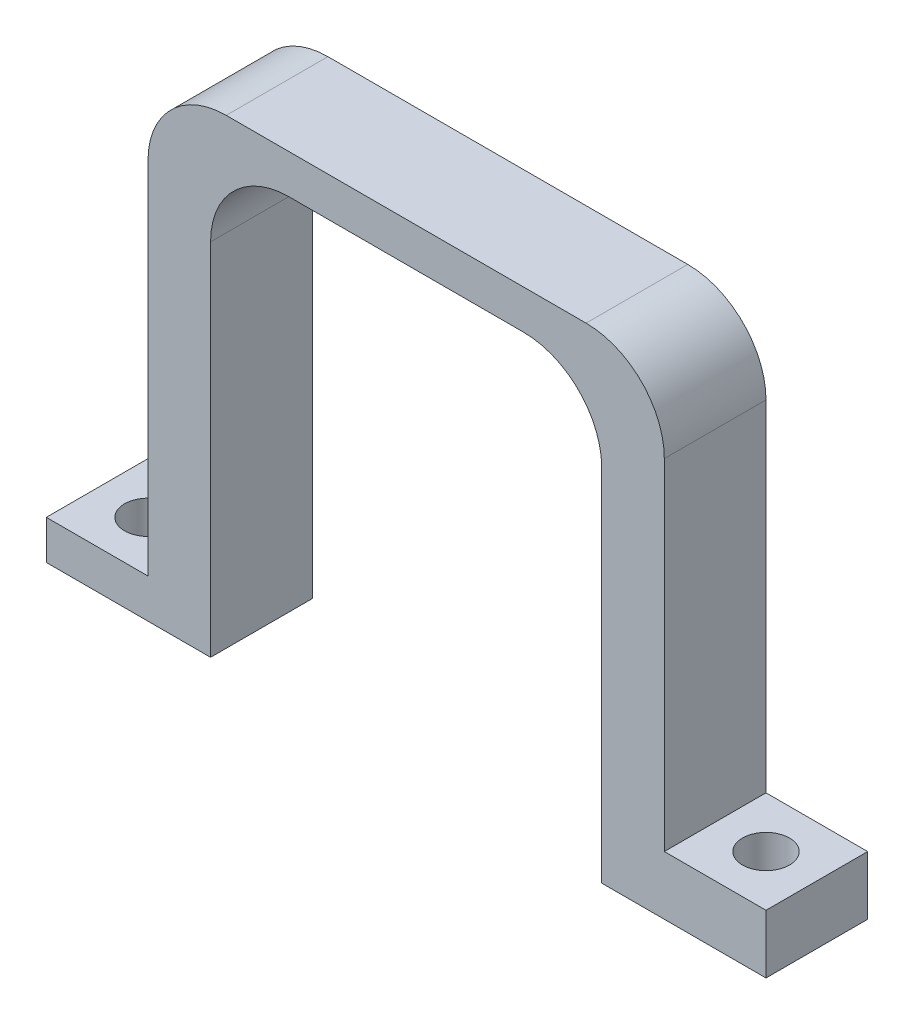
ISO-10303-21;
HEADER;
FILE_DESCRIPTION(('STEP AP214'),'2;1');
FILE_NAME('part.step','',(''),(''),'','','');
FILE_SCHEMA(('AUTOMOTIVE_DESIGN { 1 0 10303 214 1 1 1 1 }'));
ENDSEC;
DATA;
#1=APPLICATION_CONTEXT('core data for automotive mechanical design processes');
#2=APPLICATION_PROTOCOL_DEFINITION('international standard','automotive_design',2000,#1);
#3=PRODUCT_CONTEXT('',#1,'mechanical');
#4=PRODUCT('Part','Part','',(#3));
#5=PRODUCT_RELATED_PRODUCT_CATEGORY('part','',(#4));
#6=PRODUCT_DEFINITION_FORMATION('','',#4);
#7=PRODUCT_DEFINITION_CONTEXT('part definition',#1,'design');
#8=PRODUCT_DEFINITION('design','',#6,#7);
#9=PRODUCT_DEFINITION_SHAPE('','',#8);
#10=(LENGTH_UNIT() NAMED_UNIT(*) SI_UNIT(.MILLI.,.METRE.));
#11=(NAMED_UNIT(*) PLANE_ANGLE_UNIT() SI_UNIT($,.RADIAN.));
#12=(NAMED_UNIT(*) SI_UNIT($,.STERADIAN.) SOLID_ANGLE_UNIT());
#13=UNCERTAINTY_MEASURE_WITH_UNIT(LENGTH_MEASURE(1.E-05),#10,'distance_accuracy_value','');
#14=(GEOMETRIC_REPRESENTATION_CONTEXT(3) GLOBAL_UNCERTAINTY_ASSIGNED_CONTEXT((#13)) GLOBAL_UNIT_ASSIGNED_CONTEXT((#10,
#11,#12)) REPRESENTATION_CONTEXT('',''));
#15=CARTESIAN_POINT('',(0.,0.,0.));
#16=DIRECTION('',(0.,0.,1.));
#17=DIRECTION('',(1.,0.,0.));
#18=AXIS2_PLACEMENT_3D('',#15,#16,#17);
#19=CARTESIAN_POINT('',(6.6,6.1,2.6));
#20=DIRECTION('',(1.,0.,0.));
#21=DIRECTION('',(0.,0.,-1.));
#22=AXIS2_PLACEMENT_3D('',#19,#20,#21);
#23=PLANE('',#22);
#24=DIRECTION('',(0.,-1.,0.));
#25=VECTOR('',#24,1.);
#26=CARTESIAN_POINT('',(6.6,6.1,2.6));
#27=LINE('',#26,#25);
#28=CARTESIAN_POINT('',(6.6,4.1,2.6));
#29=VERTEX_POINT('',#28);
#30=CARTESIAN_POINT('',(6.6,-4.6,2.6));
#31=VERTEX_POINT('',#30);
#32=EDGE_CURVE('E77',#29,#31,#27,.T.);
#33=ORIENTED_EDGE('',*,*,#32,.T.);
#34=DIRECTION('',(0.,0.,1.));
#35=VECTOR('',#34,1.);
#36=CARTESIAN_POINT('',(6.6,-4.6,0.));
#37=LINE('',#36,#35);
#38=CARTESIAN_POINT('',(6.6,-4.6,0.));
#39=VERTEX_POINT('',#38);
#40=EDGE_CURVE('E82',#39,#31,#37,.T.);
#41=ORIENTED_EDGE('',*,*,#40,.F.);
#42=DIRECTION('',(0.,-1.,0.));
#43=VECTOR('',#42,1.);
#44=CARTESIAN_POINT('',(6.6,6.1,0.));
#45=LINE('',#44,#43);
#46=CARTESIAN_POINT('',(6.6,4.1,0.));
#47=VERTEX_POINT('',#46);
#48=EDGE_CURVE('E273',#47,#39,#45,.T.);
#49=ORIENTED_EDGE('',*,*,#48,.F.);
#50=DIRECTION('',(0.,0.,-1.));
#51=VECTOR('',#50,1.);
#52=CARTESIAN_POINT('',(6.6,4.1,2.6));
#53=LINE('',#52,#51);
#54=EDGE_CURVE('E290',#47,#29,#53,.F.);
#55=ORIENTED_EDGE('',*,*,#54,.T.);
#56=EDGE_LOOP('',(#33,#41,#49,#55));
#57=FACE_BOUND('',#56,.T.);
#58=ADVANCED_FACE('F61',(#57),#23,.T.);
#59=CARTESIAN_POINT('',(-6.6,6.1,2.6));
#60=DIRECTION('',(1.,0.,0.));
#61=DIRECTION('',(0.,0.,-1.));
#62=AXIS2_PLACEMENT_3D('',#59,#60,#61);
#63=PLANE('',#62);
#64=DIRECTION('',(0.,-1.,0.));
#65=VECTOR('',#64,1.);
#66=CARTESIAN_POINT('',(-6.6,6.1,0.));
#67=LINE('',#66,#65);
#68=CARTESIAN_POINT('',(-6.6,4.1,0.));
#69=VERTEX_POINT('',#68);
#70=CARTESIAN_POINT('',(-6.6,-5.09999999999996,0.));
#71=VERTEX_POINT('',#70);
#72=EDGE_CURVE('E193',#69,#71,#67,.T.);
#73=ORIENTED_EDGE('',*,*,#72,.T.);
#74=DIRECTION('',(0.,0.,-1.));
#75=VECTOR('',#74,1.);
#76=CARTESIAN_POINT('',(-6.6,-5.09999999999996,2.6));
#77=LINE('',#76,#75);
#78=CARTESIAN_POINT('',(-6.6,-5.09999999999996,2.6));
#79=VERTEX_POINT('',#78);
#80=EDGE_CURVE('E190',#79,#71,#77,.T.);
#81=ORIENTED_EDGE('',*,*,#80,.F.);
#82=DIRECTION('',(0.,-1.,0.));
#83=VECTOR('',#82,1.);
#84=CARTESIAN_POINT('',(-6.6,6.1,2.6));
#85=LINE('',#84,#83);
#86=CARTESIAN_POINT('',(-6.6,4.1,2.6));
#87=VERTEX_POINT('',#86);
#88=EDGE_CURVE('E174',#87,#79,#85,.T.);
#89=ORIENTED_EDGE('',*,*,#88,.F.);
#90=DIRECTION('',(0.,0.,-1.));
#91=VECTOR('',#90,1.);
#92=CARTESIAN_POINT('',(-6.6,4.1,0.));
#93=LINE('',#92,#91);
#94=EDGE_CURVE('E267',#87,#69,#93,.T.);
#95=ORIENTED_EDGE('',*,*,#94,.T.);
#96=EDGE_LOOP('',(#73,#81,#89,#95));
#97=FACE_BOUND('',#96,.T.);
#98=ADVANCED_FACE('F191',(#97),#63,.F.);
#99=CARTESIAN_POINT('',(-6.6,-6.1,2.6));
#100=DIRECTION('',(0.,1.,0.));
#101=DIRECTION('',(0.,0.,1.));
#102=AXIS2_PLACEMENT_3D('',#99,#100,#101);
#103=PLANE('',#102);
#104=DIRECTION('',(0.,0.,-1.));
#105=VECTOR('',#104,1.);
#106=CARTESIAN_POINT('',(-5.,-6.1,2.6));
#107=LINE('',#106,#105);
#108=CARTESIAN_POINT('',(-5.,-6.1,2.6));
#109=VERTEX_POINT('',#108);
#110=CARTESIAN_POINT('',(-5.,-6.1,0.));
#111=VERTEX_POINT('',#110);
#112=EDGE_CURVE('E255',#109,#111,#107,.T.);
#113=ORIENTED_EDGE('',*,*,#112,.F.);
#114=DIRECTION('',(1.,0.,0.));
#115=VECTOR('',#114,1.);
#116=CARTESIAN_POINT('',(-6.6,-6.1,2.6));
#117=LINE('',#116,#115);
#118=CARTESIAN_POINT('',(-9.19999999999999,-6.1,2.6));
#119=VERTEX_POINT('',#118);
#120=EDGE_CURVE('E260',#119,#109,#117,.T.);
#121=ORIENTED_EDGE('',*,*,#120,.F.);
#122=DIRECTION('',(0.,0.,1.));
#123=VECTOR('',#122,1.);
#124=CARTESIAN_POINT('',(-9.19999999999999,-6.1,0.));
#125=LINE('',#124,#123);
#126=CARTESIAN_POINT('',(-9.19999999999999,-6.1,0.));
#127=VERTEX_POINT('',#126);
#128=EDGE_CURVE('E233',#127,#119,#125,.T.);
#129=ORIENTED_EDGE('',*,*,#128,.F.);
#130=DIRECTION('',(1.,0.,0.));
#131=VECTOR('',#130,1.);
#132=CARTESIAN_POINT('',(-6.6,-6.1,0.));
#133=LINE('',#132,#131);
#134=EDGE_CURVE('E270',#127,#111,#133,.T.);
#135=ORIENTED_EDGE('',*,*,#134,.T.);
#136=EDGE_LOOP('',(#113,#121,#129,#135));
#137=FACE_BOUND('',#136,.T.);
#138=CARTESIAN_POINT('',(-7.89999999999999,-6.1,1.3));
#139=DIRECTION('',(0.,-1.,0.));
#140=DIRECTION('',(0.,0.,-1.));
#141=AXIS2_PLACEMENT_3D('',#138,#139,#140);
#142=CIRCLE('',#141,0.6);
#143=CARTESIAN_POINT('',(-7.89999999999999,-6.1,0.7));
#144=VERTEX_POINT('',#143);
#145=EDGE_CURVE('E228',#144,#144,#142,.T.);
#146=ORIENTED_EDGE('',*,*,#145,.F.);
#147=EDGE_LOOP('',(#146));
#148=FACE_BOUND('',#147,.T.);
#149=ADVANCED_FACE('F355',(#137,#148),#103,.F.);
#150=CARTESIAN_POINT('',(0.,0.,2.6));
#151=DIRECTION('',(0.,0.,1.));
#152=DIRECTION('',(1.,0.,0.));
#153=AXIS2_PLACEMENT_3D('',#150,#151,#152);
#154=PLANE('',#153);
#155=ORIENTED_EDGE('',*,*,#88,.T.);
#156=DIRECTION('',(-1.,0.,0.));
#157=VECTOR('',#156,1.);
#158=CARTESIAN_POINT('',(-6.6,-5.09999999999996,2.6));
#159=LINE('',#158,#157);
#160=CARTESIAN_POINT('',(-9.19999999999999,-5.09999999999996,2.6));
#161=VERTEX_POINT('',#160);
#162=EDGE_CURVE('E178',#79,#161,#159,.T.);
#163=ORIENTED_EDGE('',*,*,#162,.T.);
#164=DIRECTION('',(0.,-1.,0.));
#165=VECTOR('',#164,1.);
#166=CARTESIAN_POINT('',(-9.19999999999999,-4.6,2.6));
#167=LINE('',#166,#165);
#168=EDGE_CURVE('E237',#161,#119,#167,.T.);
#169=ORIENTED_EDGE('',*,*,#168,.T.);
#170=ORIENTED_EDGE('',*,*,#120,.T.);
#171=DIRECTION('',(0.,-1.,0.));
#172=VECTOR('',#171,1.);
#173=CARTESIAN_POINT('',(-5.,5.1,2.6));
#174=LINE('',#173,#172);
#175=CARTESIAN_POINT('',(-5.,3.1,2.6));
#176=VERTEX_POINT('',#175);
#177=EDGE_CURVE('E247',#176,#109,#174,.T.);
#178=ORIENTED_EDGE('',*,*,#177,.F.);
#179=CARTESIAN_POINT('',(-3.,3.1,2.6));
#180=DIRECTION('',(0.,0.,1.));
#181=DIRECTION('',(1.,0.,0.));
#182=AXIS2_PLACEMENT_3D('',#179,#180,#181);
#183=CIRCLE('',#182,2.);
#184=CARTESIAN_POINT('',(-3.,5.1,2.6));
#185=VERTEX_POINT('',#184);
#186=EDGE_CURVE('E304',#176,#185,#183,.F.);
#187=ORIENTED_EDGE('',*,*,#186,.T.);
#188=DIRECTION('',(1.,0.,0.));
#189=VECTOR('',#188,1.);
#190=CARTESIAN_POINT('',(-5.,5.1,2.6));
#191=LINE('',#190,#189);
#192=CARTESIAN_POINT('',(3.,5.1,2.6));
#193=VERTEX_POINT('',#192);
#194=EDGE_CURVE('E241',#185,#193,#191,.T.);
#195=ORIENTED_EDGE('',*,*,#194,.T.);
#196=CARTESIAN_POINT('',(3.,3.1,2.6));
#197=DIRECTION('',(0.,0.,1.));
#198=DIRECTION('',(1.,0.,0.));
#199=AXIS2_PLACEMENT_3D('',#196,#197,#198);
#200=CIRCLE('',#199,2.);
#201=CARTESIAN_POINT('',(5.,3.1,2.6));
#202=VERTEX_POINT('',#201);
#203=EDGE_CURVE('E12',#193,#202,#200,.F.);
#204=ORIENTED_EDGE('',*,*,#203,.T.);
#205=DIRECTION('',(0.,-1.,0.));
#206=VECTOR('',#205,1.);
#207=CARTESIAN_POINT('',(5.,5.1,2.6));
#208=LINE('',#207,#206);
#209=CARTESIAN_POINT('',(5.,-6.1,2.6));
#210=VERTEX_POINT('',#209);
#211=EDGE_CURVE('E244',#202,#210,#208,.T.);
#212=ORIENTED_EDGE('',*,*,#211,.T.);
#213=CARTESIAN_POINT('',(9.2,-6.1,2.6));
#214=VERTEX_POINT('',#213);
#215=EDGE_CURVE('E186',#210,#214,#117,.T.);
#216=ORIENTED_EDGE('',*,*,#215,.T.);
#217=DIRECTION('',(0.,-1.,0.));
#218=VECTOR('',#217,1.);
#219=CARTESIAN_POINT('',(9.2,-4.6,2.6));
#220=LINE('',#219,#218);
#221=CARTESIAN_POINT('',(9.2,-4.6,2.6));
#222=VERTEX_POINT('',#221);
#223=EDGE_CURVE('E225',#222,#214,#220,.T.);
#224=ORIENTED_EDGE('',*,*,#223,.F.);
#225=DIRECTION('',(1.,0.,0.));
#226=VECTOR('',#225,1.);
#227=CARTESIAN_POINT('',(0.,-4.6,2.6));
#228=LINE('',#227,#226);
#229=EDGE_CURVE('E216',#31,#222,#228,.T.);
#230=ORIENTED_EDGE('',*,*,#229,.F.);
#231=ORIENTED_EDGE('',*,*,#32,.F.);
#232=CARTESIAN_POINT('',(4.6,4.1,2.6));
#233=DIRECTION('',(0.,0.,1.));
#234=DIRECTION('',(1.,0.,0.));
#235=AXIS2_PLACEMENT_3D('',#232,#233,#234);
#236=CIRCLE('',#235,2.);
#237=CARTESIAN_POINT('',(4.6,6.1,2.6));
#238=VERTEX_POINT('',#237);
#239=EDGE_CURVE('E287',#29,#238,#236,.T.);
#240=ORIENTED_EDGE('',*,*,#239,.T.);
#241=DIRECTION('',(1.,0.,0.));
#242=VECTOR('',#241,1.);
#243=CARTESIAN_POINT('',(-6.6,6.1,2.6));
#244=LINE('',#243,#242);
#245=CARTESIAN_POINT('',(-4.6,6.1,2.6));
#246=VERTEX_POINT('',#245);
#247=EDGE_CURVE('E264',#246,#238,#244,.T.);
#248=ORIENTED_EDGE('',*,*,#247,.F.);
#249=CARTESIAN_POINT('',(-4.6,4.1,2.6));
#250=DIRECTION('',(0.,0.,1.));
#251=DIRECTION('',(1.,0.,0.));
#252=AXIS2_PLACEMENT_3D('',#249,#250,#251);
#253=CIRCLE('',#252,2.);
#254=EDGE_CURVE('E182',#246,#87,#253,.T.);
#255=ORIENTED_EDGE('',*,*,#254,.T.);
#256=EDGE_LOOP('',(#155,#163,#169,#170,#178,#187,#195,#204,#212,#216,#224,#230,#231,#240,#248,#255));
#257=FACE_BOUND('',#256,.T.);
#258=ADVANCED_FACE('F176',(#257),#154,.T.);
#259=CARTESIAN_POINT('',(0.,0.,0.));
#260=DIRECTION('',(0.,0.,1.));
#261=DIRECTION('',(1.,0.,0.));
#262=AXIS2_PLACEMENT_3D('',#259,#260,#261);
#263=PLANE('',#262);
#264=DIRECTION('',(-1.,0.,0.));
#265=VECTOR('',#264,1.);
#266=CARTESIAN_POINT('',(-6.6,-5.09999999999996,0.));
#267=LINE('',#266,#265);
#268=CARTESIAN_POINT('',(-9.19999999999999,-5.09999999999996,0.));
#269=VERTEX_POINT('',#268);
#270=EDGE_CURVE('E201',#71,#269,#267,.T.);
#271=ORIENTED_EDGE('',*,*,#270,.F.);
#272=ORIENTED_EDGE('',*,*,#72,.F.);
#273=CARTESIAN_POINT('',(-4.6,4.1,0.));
#274=DIRECTION('',(0.,0.,1.));
#275=DIRECTION('',(1.,0.,0.));
#276=AXIS2_PLACEMENT_3D('',#273,#274,#275);
#277=CIRCLE('',#276,2.);
#278=CARTESIAN_POINT('',(-4.6,6.1,0.));
#279=VERTEX_POINT('',#278);
#280=EDGE_CURVE('E280',#69,#279,#277,.F.);
#281=ORIENTED_EDGE('',*,*,#280,.T.);
#282=DIRECTION('',(1.,0.,0.));
#283=VECTOR('',#282,1.);
#284=CARTESIAN_POINT('',(-6.6,6.1,0.));
#285=LINE('',#284,#283);
#286=CARTESIAN_POINT('',(4.6,6.1,0.));
#287=VERTEX_POINT('',#286);
#288=EDGE_CURVE('E187',#279,#287,#285,.T.);
#289=ORIENTED_EDGE('',*,*,#288,.T.);
#290=CARTESIAN_POINT('',(4.6,4.1,0.));
#291=DIRECTION('',(0.,0.,1.));
#292=DIRECTION('',(1.,0.,0.));
#293=AXIS2_PLACEMENT_3D('',#290,#291,#292);
#294=CIRCLE('',#293,2.);
#295=EDGE_CURVE('E278',#287,#47,#294,.F.);
#296=ORIENTED_EDGE('',*,*,#295,.T.);
#297=ORIENTED_EDGE('',*,*,#48,.T.);
#298=DIRECTION('',(1.,0.,0.));
#299=VECTOR('',#298,1.);
#300=CARTESIAN_POINT('',(0.,-4.6,0.));
#301=LINE('',#300,#299);
#302=CARTESIAN_POINT('',(9.2,-4.6,0.));
#303=VERTEX_POINT('',#302);
#304=EDGE_CURVE('E209',#39,#303,#301,.T.);
#305=ORIENTED_EDGE('',*,*,#304,.T.);
#306=DIRECTION('',(0.,-1.,0.));
#307=VECTOR('',#306,1.);
#308=CARTESIAN_POINT('',(9.2,-4.6,0.));
#309=LINE('',#308,#307);
#310=CARTESIAN_POINT('',(9.2,-6.1,0.));
#311=VERTEX_POINT('',#310);
#312=EDGE_CURVE('E219',#303,#311,#309,.T.);
#313=ORIENTED_EDGE('',*,*,#312,.T.);
#314=CARTESIAN_POINT('',(5.,-6.1,0.));
#315=VERTEX_POINT('',#314);
#316=EDGE_CURVE('E269',#315,#311,#133,.T.);
#317=ORIENTED_EDGE('',*,*,#316,.F.);
#318=DIRECTION('',(0.,-1.,0.));
#319=VECTOR('',#318,1.);
#320=CARTESIAN_POINT('',(5.,5.1,0.));
#321=LINE('',#320,#319);
#322=CARTESIAN_POINT('',(5.,3.1,0.));
#323=VERTEX_POINT('',#322);
#324=EDGE_CURVE('E252',#323,#315,#321,.T.);
#325=ORIENTED_EDGE('',*,*,#324,.F.);
#326=CARTESIAN_POINT('',(3.,3.1,0.));
#327=DIRECTION('',(0.,0.,1.));
#328=DIRECTION('',(1.,0.,0.));
#329=AXIS2_PLACEMENT_3D('',#326,#327,#328);
#330=CIRCLE('',#329,2.);
#331=CARTESIAN_POINT('',(3.,5.1,0.));
#332=VERTEX_POINT('',#331);
#333=EDGE_CURVE('E70',#323,#332,#330,.T.);
#334=ORIENTED_EDGE('',*,*,#333,.T.);
#335=DIRECTION('',(1.,0.,0.));
#336=VECTOR('',#335,1.);
#337=CARTESIAN_POINT('',(-5.,5.1,0.));
#338=LINE('',#337,#336);
#339=CARTESIAN_POINT('',(-3.,5.1,0.));
#340=VERTEX_POINT('',#339);
#341=EDGE_CURVE('E239',#340,#332,#338,.T.);
#342=ORIENTED_EDGE('',*,*,#341,.F.);
#343=CARTESIAN_POINT('',(-3.,3.1,0.));
#344=DIRECTION('',(0.,0.,1.));
#345=DIRECTION('',(1.,0.,0.));
#346=AXIS2_PLACEMENT_3D('',#343,#344,#345);
#347=CIRCLE('',#346,2.);
#348=CARTESIAN_POINT('',(-5.,3.1,0.));
#349=VERTEX_POINT('',#348);
#350=EDGE_CURVE('E302',#340,#349,#347,.T.);
#351=ORIENTED_EDGE('',*,*,#350,.T.);
#352=DIRECTION('',(0.,-1.,0.));
#353=VECTOR('',#352,1.);
#354=CARTESIAN_POINT('',(-5.,5.1,0.));
#355=LINE('',#354,#353);
#356=EDGE_CURVE('E245',#349,#111,#355,.T.);
#357=ORIENTED_EDGE('',*,*,#356,.T.);
#358=ORIENTED_EDGE('',*,*,#134,.F.);
#359=DIRECTION('',(0.,-1.,0.));
#360=VECTOR('',#359,1.);
#361=CARTESIAN_POINT('',(-9.19999999999999,-4.6,0.));
#362=LINE('',#361,#360);
#363=EDGE_CURVE('E236',#269,#127,#362,.T.);
#364=ORIENTED_EDGE('',*,*,#363,.F.);
#365=EDGE_LOOP('',(#271,#272,#281,#289,#296,#297,#305,#313,#317,#325,#334,#342,#351,#357,#358,#364));
#366=FACE_BOUND('',#365,.T.);
#367=ADVANCED_FACE('F309',(#366),#263,.F.);
#368=ORIENTED_EDGE('',*,*,#215,.F.);
#369=DIRECTION('',(0.,0.,-1.));
#370=VECTOR('',#369,1.);
#371=CARTESIAN_POINT('',(5.,-6.1,2.6));
#372=LINE('',#371,#370);
#373=EDGE_CURVE('E249',#210,#315,#372,.T.);
#374=ORIENTED_EDGE('',*,*,#373,.T.);
#375=ORIENTED_EDGE('',*,*,#316,.T.);
#376=DIRECTION('',(0.,0.,1.));
#377=VECTOR('',#376,1.);
#378=CARTESIAN_POINT('',(9.2,-6.1,0.));
#379=LINE('',#378,#377);
#380=EDGE_CURVE('E210',#311,#214,#379,.T.);
#381=ORIENTED_EDGE('',*,*,#380,.T.);
#382=EDGE_LOOP('',(#368,#374,#375,#381));
#383=FACE_BOUND('',#382,.T.);
#384=CARTESIAN_POINT('',(7.9,-6.1,1.3));
#385=DIRECTION('',(0.,-1.,0.));
#386=DIRECTION('',(0.,0.,-1.));
#387=AXIS2_PLACEMENT_3D('',#384,#385,#386);
#388=CIRCLE('',#387,0.6);
#389=CARTESIAN_POINT('',(7.9,-6.1,0.7));
#390=VERTEX_POINT('',#389);
#391=EDGE_CURVE('E220',#390,#390,#388,.T.);
#392=ORIENTED_EDGE('',*,*,#391,.F.);
#393=EDGE_LOOP('',(#392));
#394=FACE_BOUND('',#393,.T.);
#395=ADVANCED_FACE('F325',(#383,#394),#103,.F.);
#396=CARTESIAN_POINT('',(-6.6,6.1,2.6));
#397=DIRECTION('',(0.,1.,0.));
#398=DIRECTION('',(0.,0.,1.));
#399=AXIS2_PLACEMENT_3D('',#396,#397,#398);
#400=PLANE('',#399);
#401=ORIENTED_EDGE('',*,*,#288,.F.);
#402=DIRECTION('',(0.,0.,-1.));
#403=VECTOR('',#402,1.);
#404=CARTESIAN_POINT('',(-4.6,6.1,2.6));
#405=LINE('',#404,#403);
#406=EDGE_CURVE('E285',#279,#246,#405,.F.);
#407=ORIENTED_EDGE('',*,*,#406,.T.);
#408=ORIENTED_EDGE('',*,*,#247,.T.);
#409=DIRECTION('',(0.,0.,-1.));
#410=VECTOR('',#409,1.);
#411=CARTESIAN_POINT('',(4.6,6.1,2.6));
#412=LINE('',#411,#410);
#413=EDGE_CURVE('E282',#238,#287,#412,.T.);
#414=ORIENTED_EDGE('',*,*,#413,.T.);
#415=EDGE_LOOP('',(#401,#407,#408,#414));
#416=FACE_BOUND('',#415,.T.);
#417=ADVANCED_FACE('F342',(#416),#400,.T.);
#418=CARTESIAN_POINT('',(-5.,5.1,2.6));
#419=DIRECTION('',(0.,1.,0.));
#420=DIRECTION('',(-1.,0.,0.));
#421=AXIS2_PLACEMENT_3D('',#418,#419,#420);
#422=PLANE('',#421);
#423=ORIENTED_EDGE('',*,*,#194,.F.);
#424=DIRECTION('',(0.,0.,-1.));
#425=VECTOR('',#424,1.);
#426=CARTESIAN_POINT('',(-3.,5.1,2.6));
#427=LINE('',#426,#425);
#428=EDGE_CURVE('E294',#185,#340,#427,.T.);
#429=ORIENTED_EDGE('',*,*,#428,.T.);
#430=ORIENTED_EDGE('',*,*,#341,.T.);
#431=DIRECTION('',(0.,0.,-1.));
#432=VECTOR('',#431,1.);
#433=CARTESIAN_POINT('',(3.,5.1,2.6));
#434=LINE('',#433,#432);
#435=EDGE_CURVE('E292',#332,#193,#434,.F.);
#436=ORIENTED_EDGE('',*,*,#435,.T.);
#437=EDGE_LOOP('',(#423,#429,#430,#436));
#438=FACE_BOUND('',#437,.T.);
#439=ADVANCED_FACE('F316',(#438),#422,.F.);
#440=CARTESIAN_POINT('',(-5.,5.1,2.6));
#441=DIRECTION('',(1.,0.,0.));
#442=DIRECTION('',(0.,1.,0.));
#443=AXIS2_PLACEMENT_3D('',#440,#441,#442);
#444=PLANE('',#443);
#445=ORIENTED_EDGE('',*,*,#356,.F.);
#446=DIRECTION('',(0.,0.,-1.));
#447=VECTOR('',#446,1.);
#448=CARTESIAN_POINT('',(-5.,3.1,2.6));
#449=LINE('',#448,#447);
#450=EDGE_CURVE('E297',#349,#176,#449,.F.);
#451=ORIENTED_EDGE('',*,*,#450,.T.);
#452=ORIENTED_EDGE('',*,*,#177,.T.);
#453=ORIENTED_EDGE('',*,*,#112,.T.);
#454=EDGE_LOOP('',(#445,#451,#452,#453));
#455=FACE_BOUND('',#454,.T.);
#456=ADVANCED_FACE('F359',(#455),#444,.T.);
#457=CARTESIAN_POINT('',(5.,5.1,2.6));
#458=DIRECTION('',(1.,0.,0.));
#459=DIRECTION('',(0.,1.,0.));
#460=AXIS2_PLACEMENT_3D('',#457,#458,#459);
#461=PLANE('',#460);
#462=ORIENTED_EDGE('',*,*,#211,.F.);
#463=DIRECTION('',(0.,0.,-1.));
#464=VECTOR('',#463,1.);
#465=CARTESIAN_POINT('',(5.,3.1,0.));
#466=LINE('',#465,#464);
#467=EDGE_CURVE('E299',#202,#323,#466,.T.);
#468=ORIENTED_EDGE('',*,*,#467,.T.);
#469=ORIENTED_EDGE('',*,*,#324,.T.);
#470=ORIENTED_EDGE('',*,*,#373,.F.);
#471=EDGE_LOOP('',(#462,#468,#469,#470));
#472=FACE_BOUND('',#471,.T.);
#473=ADVANCED_FACE('F322',(#472),#461,.F.);
#474=CARTESIAN_POINT('',(-4.6,4.1,2.6));
#475=DIRECTION('',(0.,0.,1.));
#476=DIRECTION('',(1.,0.,0.));
#477=AXIS2_PLACEMENT_3D('',#474,#475,#476);
#478=CYLINDRICAL_SURFACE('',#477,2.);
#479=ORIENTED_EDGE('',*,*,#254,.F.);
#480=ORIENTED_EDGE('',*,*,#406,.F.);
#481=ORIENTED_EDGE('',*,*,#280,.F.);
#482=ORIENTED_EDGE('',*,*,#94,.F.);
#483=EDGE_LOOP('',(#479,#480,#481,#482));
#484=FACE_BOUND('',#483,.T.);
#485=ADVANCED_FACE('F345',(#484),#478,.T.);
#486=CARTESIAN_POINT('',(4.6,4.1,2.6));
#487=DIRECTION('',(0.,0.,-1.));
#488=DIRECTION('',(-1.,0.,0.));
#489=AXIS2_PLACEMENT_3D('',#486,#487,#488);
#490=CYLINDRICAL_SURFACE('',#489,2.);
#491=ORIENTED_EDGE('',*,*,#239,.F.);
#492=ORIENTED_EDGE('',*,*,#54,.F.);
#493=ORIENTED_EDGE('',*,*,#295,.F.);
#494=ORIENTED_EDGE('',*,*,#413,.F.);
#495=EDGE_LOOP('',(#491,#492,#493,#494));
#496=FACE_BOUND('',#495,.T.);
#497=ADVANCED_FACE('F338',(#496),#490,.T.);
#498=CARTESIAN_POINT('',(-3.,3.1,2.6));
#499=DIRECTION('',(0.,0.,-1.));
#500=DIRECTION('',(-1.,0.,0.));
#501=AXIS2_PLACEMENT_3D('',#498,#499,#500);
#502=CYLINDRICAL_SURFACE('',#501,2.);
#503=ORIENTED_EDGE('',*,*,#186,.F.);
#504=ORIENTED_EDGE('',*,*,#450,.F.);
#505=ORIENTED_EDGE('',*,*,#350,.F.);
#506=ORIENTED_EDGE('',*,*,#428,.F.);
#507=EDGE_LOOP('',(#503,#504,#505,#506));
#508=FACE_BOUND('',#507,.T.);
#509=ADVANCED_FACE('F363',(#508),#502,.F.);
#510=CARTESIAN_POINT('',(3.,3.1,2.6));
#511=DIRECTION('',(0.,0.,1.));
#512=DIRECTION('',(1.,0.,0.));
#513=AXIS2_PLACEMENT_3D('',#510,#511,#512);
#514=CYLINDRICAL_SURFACE('',#513,2.);
#515=ORIENTED_EDGE('',*,*,#203,.F.);
#516=ORIENTED_EDGE('',*,*,#435,.F.);
#517=ORIENTED_EDGE('',*,*,#333,.F.);
#518=ORIENTED_EDGE('',*,*,#467,.F.);
#519=EDGE_LOOP('',(#515,#516,#517,#518));
#520=FACE_BOUND('',#519,.T.);
#521=ADVANCED_FACE('F63',(#520),#514,.F.);
#522=CARTESIAN_POINT('',(-9.19999999999999,-4.6,0.));
#523=DIRECTION('',(1.,0.,0.));
#524=DIRECTION('',(0.,0.,-1.));
#525=AXIS2_PLACEMENT_3D('',#522,#523,#524);
#526=PLANE('',#525);
#527=ORIENTED_EDGE('',*,*,#168,.F.);
#528=DIRECTION('',(0.,0.,-1.));
#529=VECTOR('',#528,1.);
#530=CARTESIAN_POINT('',(-9.19999999999999,-5.09999999999996,2.6));
#531=LINE('',#530,#529);
#532=EDGE_CURVE('E196',#161,#269,#531,.T.);
#533=ORIENTED_EDGE('',*,*,#532,.T.);
#534=ORIENTED_EDGE('',*,*,#363,.T.);
#535=ORIENTED_EDGE('',*,*,#128,.T.);
#536=EDGE_LOOP('',(#527,#533,#534,#535));
#537=FACE_BOUND('',#536,.T.);
#538=ADVANCED_FACE('F349',(#537),#526,.F.);
#539=CARTESIAN_POINT('',(-7.89999999999999,-4.6,1.3));
#540=DIRECTION('',(0.,-1.,0.));
#541=DIRECTION('',(0.,0.,-1.));
#542=AXIS2_PLACEMENT_3D('',#539,#540,#541);
#543=CYLINDRICAL_SURFACE('',#542,0.6);
#544=CARTESIAN_POINT('',(-7.89999999999999,-5.09999999999996,1.3));
#545=DIRECTION('',(0.,-1.,0.));
#546=DIRECTION('',(0.,0.,-1.));
#547=AXIS2_PLACEMENT_3D('',#544,#545,#546);
#548=CIRCLE('',#547,0.6);
#549=CARTESIAN_POINT('',(-7.89999999999999,-5.09999999999996,0.7));
#550=VERTEX_POINT('',#549);
#551=EDGE_CURVE('E65',#550,#550,#548,.F.);
#552=ORIENTED_EDGE('',*,*,#551,.T.);
#553=EDGE_LOOP('',(#552));
#554=FACE_BOUND('',#553,.T.);
#555=ORIENTED_EDGE('',*,*,#145,.T.);
#556=EDGE_LOOP('',(#555));
#557=FACE_BOUND('',#556,.T.);
#558=ADVANCED_FACE('F414',(#554,#557),#543,.F.);
#559=CARTESIAN_POINT('',(7.9,-4.6,1.3));
#560=DIRECTION('',(0.,-1.,0.));
#561=DIRECTION('',(0.,0.,-1.));
#562=AXIS2_PLACEMENT_3D('',#559,#560,#561);
#563=CYLINDRICAL_SURFACE('',#562,0.6);
#564=CARTESIAN_POINT('',(7.9,-4.6,1.3));
#565=DIRECTION('',(0.,-1.,0.));
#566=DIRECTION('',(0.,0.,-1.));
#567=AXIS2_PLACEMENT_3D('',#564,#565,#566);
#568=CIRCLE('',#567,0.6);
#569=CARTESIAN_POINT('',(7.9,-4.6,0.7));
#570=VERTEX_POINT('',#569);
#571=EDGE_CURVE('E206',#570,#570,#568,.T.);
#572=ORIENTED_EDGE('',*,*,#571,.F.);
#573=EDGE_LOOP('',(#572));
#574=FACE_BOUND('',#573,.T.);
#575=ORIENTED_EDGE('',*,*,#391,.T.);
#576=EDGE_LOOP('',(#575));
#577=FACE_BOUND('',#576,.T.);
#578=ADVANCED_FACE('F421',(#574,#577),#563,.F.);
#579=CARTESIAN_POINT('',(9.2,-4.6,0.));
#580=DIRECTION('',(1.,0.,0.));
#581=DIRECTION('',(0.,0.,-1.));
#582=AXIS2_PLACEMENT_3D('',#579,#580,#581);
#583=PLANE('',#582);
#584=ORIENTED_EDGE('',*,*,#380,.F.);
#585=ORIENTED_EDGE('',*,*,#312,.F.);
#586=DIRECTION('',(0.,0.,1.));
#587=VECTOR('',#586,1.);
#588=CARTESIAN_POINT('',(9.2,-4.6,0.));
#589=LINE('',#588,#587);
#590=EDGE_CURVE('E213',#303,#222,#589,.T.);
#591=ORIENTED_EDGE('',*,*,#590,.T.);
#592=ORIENTED_EDGE('',*,*,#223,.T.);
#593=EDGE_LOOP('',(#584,#585,#591,#592));
#594=FACE_BOUND('',#593,.T.);
#595=ADVANCED_FACE('F330',(#594),#583,.T.);
#596=CARTESIAN_POINT('',(0.,-4.6,0.));
#597=DIRECTION('',(0.,-1.,0.));
#598=DIRECTION('',(0.,0.,-1.));
#599=AXIS2_PLACEMENT_3D('',#596,#597,#598);
#600=PLANE('',#599);
#601=ORIENTED_EDGE('',*,*,#571,.T.);
#602=EDGE_LOOP('',(#601));
#603=FACE_BOUND('',#602,.T.);
#604=ORIENTED_EDGE('',*,*,#304,.F.);
#605=ORIENTED_EDGE('',*,*,#40,.T.);
#606=ORIENTED_EDGE('',*,*,#229,.T.);
#607=ORIENTED_EDGE('',*,*,#590,.F.);
#608=EDGE_LOOP('',(#604,#605,#606,#607));
#609=FACE_BOUND('',#608,.T.);
#610=ADVANCED_FACE('F334',(#603,#609),#600,.F.);
#611=CARTESIAN_POINT('',(-6.6,-5.09999999999996,2.6));
#612=DIRECTION('',(0.,-1.,0.));
#613=DIRECTION('',(0.,0.,-1.));
#614=AXIS2_PLACEMENT_3D('',#611,#612,#613);
#615=PLANE('',#614);
#616=ORIENTED_EDGE('',*,*,#270,.T.);
#617=ORIENTED_EDGE('',*,*,#532,.F.);
#618=ORIENTED_EDGE('',*,*,#162,.F.);
#619=ORIENTED_EDGE('',*,*,#80,.T.);
#620=EDGE_LOOP('',(#616,#617,#618,#619));
#621=FACE_BOUND('',#620,.T.);
#622=ORIENTED_EDGE('',*,*,#551,.F.);
#623=EDGE_LOOP('',(#622));
#624=FACE_BOUND('',#623,.T.);
#625=ADVANCED_FACE('F198',(#621,#624),#615,.F.);
#626=CLOSED_SHELL('',(#58,#98,#149,#258,#367,#395,#417,#439,#456,#473,#485,#497,#509,#521,#538,
#558,#578,#595,#610,#625));
#627=MANIFOLD_SOLID_BREP('B2',#626);
#628=ADVANCED_BREP_SHAPE_REPRESENTATION('',(#18,#627),#14);
#629=SHAPE_DEFINITION_REPRESENTATION(#9,#628);
ENDSEC;
END-ISO-10303-21;
